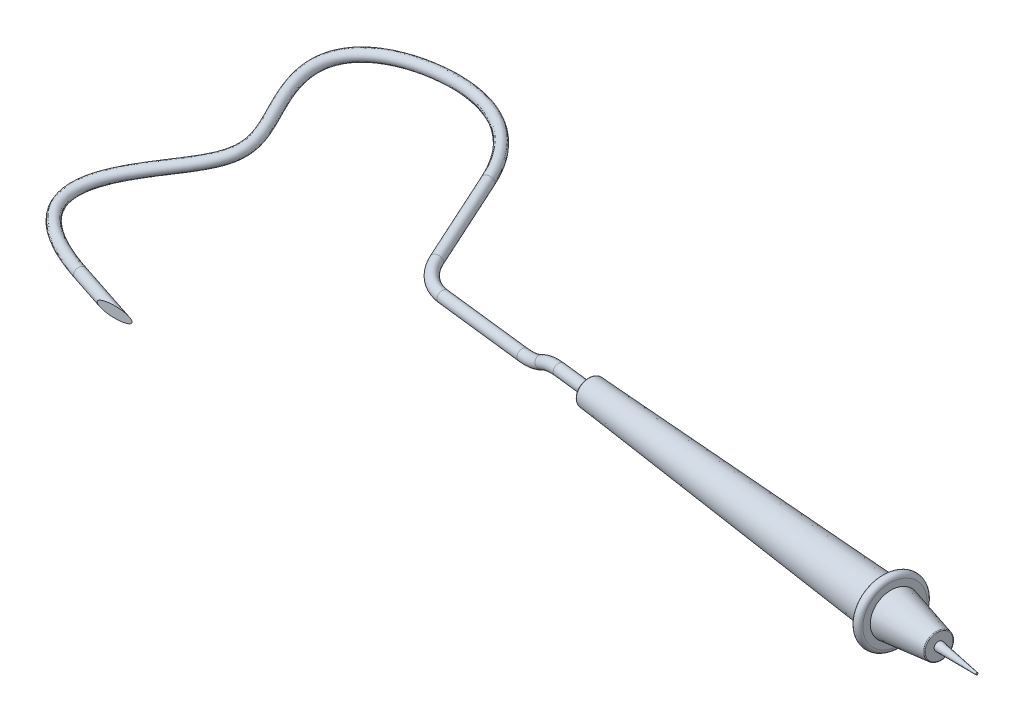
ISO-10303-21;
HEADER;
FILE_DESCRIPTION(('STEP AP214'),'2;1');
FILE_NAME('part.step','',(''),(''),'','','');
FILE_SCHEMA(('AUTOMOTIVE_DESIGN { 1 0 10303 214 1 1 1 1 }'));
ENDSEC;
DATA;
#1=APPLICATION_CONTEXT('core data for automotive mechanical design processes');
#2=APPLICATION_PROTOCOL_DEFINITION('international standard','automotive_design',2000,#1);
#3=PRODUCT_CONTEXT('',#1,'mechanical');
#4=PRODUCT('Part','Part','',(#3));
#5=PRODUCT_RELATED_PRODUCT_CATEGORY('part','',(#4));
#6=PRODUCT_DEFINITION_FORMATION('','',#4);
#7=PRODUCT_DEFINITION_CONTEXT('part definition',#1,'design');
#8=PRODUCT_DEFINITION('design','',#6,#7);
#9=PRODUCT_DEFINITION_SHAPE('','',#8);
#10=(LENGTH_UNIT() NAMED_UNIT(*) SI_UNIT(.MILLI.,.METRE.));
#11=(NAMED_UNIT(*) PLANE_ANGLE_UNIT() SI_UNIT($,.RADIAN.));
#12=(NAMED_UNIT(*) SI_UNIT($,.STERADIAN.) SOLID_ANGLE_UNIT());
#13=UNCERTAINTY_MEASURE_WITH_UNIT(LENGTH_MEASURE(1.E-05),#10,'distance_accuracy_value','');
#14=(GEOMETRIC_REPRESENTATION_CONTEXT(3) GLOBAL_UNCERTAINTY_ASSIGNED_CONTEXT((#13)) GLOBAL_UNIT_ASSIGNED_CONTEXT((#10,
#11,#12)) REPRESENTATION_CONTEXT('',''));
#15=CARTESIAN_POINT('',(0.,0.,0.));
#16=DIRECTION('',(0.,0.,1.));
#17=DIRECTION('',(1.,0.,0.));
#18=AXIS2_PLACEMENT_3D('',#15,#16,#17);
#19=CARTESIAN_POINT('',(-100.92677059176,1.28955605755528,-46.3495774754602));
#20=DIRECTION('',(-0.950247012060814,0.,-0.311497377307572));
#21=DIRECTION('',(-0.0139806644155085,0.998992289660299,0.0426491057558538));
#22=AXIS2_PLACEMENT_3D('',#19,#20,#21);
#23=CYLINDRICAL_SURFACE('',#22,1.25);
#24=CARTESIAN_POINT('',(-123.766941899785,1.28955605755528,-53.8367396232008));
#25=DIRECTION('',(-0.950247012060814,0.,-0.311497377307572));
#26=DIRECTION('',(-0.0139806644155084,0.998992289660299,0.0426491057558539));
#27=AXIS2_PLACEMENT_3D('',#24,#25,#26);
#28=CIRCLE('',#27,1.25);
#29=CARTESIAN_POINT('',(-123.749466069266,0.0408156954799094,-53.8900510053956));
#30=VERTEX_POINT('',#29);
#31=EDGE_CURVE('P0_E11',#30,#30,#28,.T.);
#32=ORIENTED_EDGE('',*,*,#31,.F.);
#33=EDGE_LOOP('',(#32));
#34=FACE_BOUND('',#33,.T.);
#35=CARTESIAN_POINT('',(-112.062668834905,1.28955605755528,-50.));
#36=DIRECTION('',(0.,0.,1.));
#37=DIRECTION('',(-1.,0.,0.));
#38=AXIS2_PLACEMENT_3D('',#35,#36,#37);
#39=ELLIPSE('',#38,4.01287487812699,1.25);
#40=CARTESIAN_POINT('',(-116.075543713031,1.28955605755528,-50.));
#41=VERTEX_POINT('',#40);
#42=EDGE_CURVE('P0_E43',#41,#41,#39,.F.);
#43=ORIENTED_EDGE('',*,*,#42,.T.);
#44=EDGE_LOOP('',(#43));
#45=FACE_BOUND('',#44,.T.);
#46=ADVANCED_FACE('P0_F40',(#34,#45),#23,.T.);
#47=CARTESIAN_POINT('',(-123.766941899785,1.28955605755528,-53.8367396232008));
#48=DIRECTION('',(0.950247012060814,0.,0.311497377307572));
#49=DIRECTION('',(-0.0139806644155084,0.998992289660299,0.0426491057558539));
#50=AXIS2_PLACEMENT_3D('',#47,#48,#49);
#51=PLANE('',#50);
#52=ORIENTED_EDGE('',*,*,#31,.T.);
#53=EDGE_LOOP('',(#52));
#54=FACE_BOUND('',#53,.T.);
#55=ADVANCED_FACE('P0_F51',(#54),#51,.F.);
#56=CARTESIAN_POINT('',(0.,0.,-50.));
#57=DIRECTION('',(0.,0.,1.));
#58=DIRECTION('',(1.,0.,0.));
#59=AXIS2_PLACEMENT_3D('',#56,#57,#58);
#60=PLANE('',#59);
#61=ORIENTED_EDGE('',*,*,#42,.F.);
#62=EDGE_LOOP('',(#61));
#63=FACE_BOUND('',#62,.T.);
#64=ADVANCED_FACE('P0_F53',(#63),#60,.T.);
#65=CLOSED_SHELL('',(#46,#55,#64));
#66=MANIFOLD_SOLID_BREP('P0_B2',#65);
#67=CARTESIAN_POINT('',(-37.564728298772,13.2649578922925,-77.7249466325446));
#68=DIRECTION('',(-0.989293869274678,-0.0311085433414069,-0.142582953913548));
#69=DIRECTION('',(-0.0552296884661834,0.984156156302759,0.168482466515979));
#70=AXIS2_PLACEMENT_3D('',#67,#68,#69);
#71=CYLINDRICAL_SURFACE('',#70,1.25);
#72=CARTESIAN_POINT('',(-29.1941082826414,13.5281737108209,-76.5185227730065));
#73=DIRECTION('',(-0.989293869274678,-0.0311085433414067,-0.142582953913548));
#74=DIRECTION('',(-0.0552296884661832,0.984156156302759,0.168482466515979));
#75=AXIS2_PLACEMENT_3D('',#72,#73,#74);
#76=CIRCLE('',#75,1.25);
#77=CARTESIAN_POINT('',(-29.1250711720587,12.2979785154425,-76.7291258561514));
#78=VERTEX_POINT('',#77);
#79=EDGE_CURVE('P1_E11',#78,#78,#76,.T.);
#80=ORIENTED_EDGE('',*,*,#79,.T.);
#81=EDGE_LOOP('',(#80));
#82=FACE_BOUND('',#81,.T.);
#83=CARTESIAN_POINT('',(-37.564728298772,13.2649578922925,-77.7249466325446));
#84=DIRECTION('',(-0.989293869274678,-0.0311085433414067,-0.142582953913548));
#85=DIRECTION('',(-0.0552296884661832,0.984156156302759,0.168482466515979));
#86=AXIS2_PLACEMENT_3D('',#83,#84,#85);
#87=CIRCLE('',#86,1.25);
#88=CARTESIAN_POINT('',(-37.4956911881893,12.0347626969141,-77.9355497156896));
#89=VERTEX_POINT('',#88);
#90=EDGE_CURVE('P1_E30',#89,#89,#87,.T.);
#91=ORIENTED_EDGE('',*,*,#90,.F.);
#92=EDGE_LOOP('',(#91));
#93=FACE_BOUND('',#92,.T.);
#94=ADVANCED_FACE('P1_F16',(#82,#93),#71,.T.);
#95=CARTESIAN_POINT('',(-37.026042810021,3.66594231229463,-79.3682486742846));
#96=DIRECTION('',(-0.135082647765971,-0.174553483329768,0.975337766996633));
#97=DIRECTION('',(-0.0552296884661834,0.984156156302759,0.168482466515979));
#98=AXIS2_PLACEMENT_3D('',#95,#96,#97);
#99=TOROIDAL_SURFACE('',#98,9.75354929044911,1.25);
#100=ORIENTED_EDGE('',*,*,#90,.T.);
#101=EDGE_LOOP('',(#100));
#102=FACE_BOUND('',#101,.T.);
#103=CARTESIAN_POINT('',(-42.5238960389427,11.6939737488602,-78.6929377177837));
#104=DIRECTION('',(-0.81487465719678,-0.540422869925287,-0.209576751382748));
#105=DIRECTION('',(-0.563677187165637,0.823088211019427,0.0692374577080555));
#106=AXIS2_PLACEMENT_3D('',#103,#104,#105);
#107=CIRCLE('',#106,1.25);
#108=CARTESIAN_POINT('',(-41.8192995549857,10.6651134850859,-78.7794845399188));
#109=VERTEX_POINT('',#108);
#110=EDGE_CURVE('P1_E81',#109,#109,#107,.T.);
#111=ORIENTED_EDGE('',*,*,#110,.F.);
#112=EDGE_LOOP('',(#111));
#113=FACE_BOUND('',#112,.T.);
#114=ADVANCED_FACE('P1_F125',(#102,#113),#99,.T.);
#115=CARTESIAN_POINT('',(-48.5174906936248,20.4458927802193,-77.9567339723218));
#116=DIRECTION('',(0.135082647765971,0.174553483329768,-0.975337766996633));
#117=DIRECTION('',(0.0552296884661834,-0.984156156302759,-0.168482466515979));
#118=AXIS2_PLACEMENT_3D('',#115,#116,#117);
#119=TOROIDAL_SURFACE('',#118,10.6330268301614,1.25);
#120=ORIENTED_EDGE('',*,*,#110,.T.);
#121=EDGE_LOOP('',(#120));
#122=FACE_BOUND('',#121,.T.);
#123=CARTESIAN_POINT('',(-47.9302319343425,9.98133396518355,-79.748212559198));
#124=DIRECTION('',(-0.989293869274678,-0.031108543341407,-0.142582953913548));
#125=DIRECTION('',(-0.0552296884661834,0.984156156302759,0.168482466515979));
#126=AXIS2_PLACEMENT_3D('',#123,#124,#125);
#127=CIRCLE('',#126,1.25);
#128=CARTESIAN_POINT('',(-47.8611948237597,8.7511387698051,-79.958815642343));
#129=VERTEX_POINT('',#128);
#130=EDGE_CURVE('P1_E153',#129,#129,#127,.T.);
#131=ORIENTED_EDGE('',*,*,#130,.F.);
#132=EDGE_LOOP('',(#131));
#133=FACE_BOUND('',#132,.T.);
#134=ADVANCED_FACE('P1_F112',(#122,#133),#119,.T.);
#135=CARTESIAN_POINT('',(-29.1941082826414,13.5281737108209,-76.5185227730065));
#136=DIRECTION('',(0.989293869274678,0.0311085433414068,0.142582953913548));
#137=DIRECTION('',(0.0552296884661832,-0.984156156302759,-0.168482466515979));
#138=AXIS2_PLACEMENT_3D('',#135,#136,#137);
#139=PLANE('',#138);
#140=ORIENTED_EDGE('',*,*,#79,.F.);
#141=EDGE_LOOP('',(#140));
#142=FACE_BOUND('',#141,.T.);
#143=ADVANCED_FACE('P1_F111',(#142),#139,.T.);
#144=CARTESIAN_POINT('',(-82.6235061058252,12.8643823183452,-107.960751642759));
#145=CARTESIAN_POINT('',(-83.9065305196409,13.3857217938381,-111.4266345033));
#146=CARTESIAN_POINT('',(-87.4736047606992,14.1111097351965,-116.833152024687));
#147=CARTESIAN_POINT('',(-94.4264787932777,14.4947694638424,-121.353421500704));
#148=CARTESIAN_POINT('',(-101.744513323956,14.4271855185951,-123.35754465081));
#149=CARTESIAN_POINT('',(-109.466253056786,14.0689839207236,-123.796421013719));
#150=CARTESIAN_POINT('',(-119.350135778554,13.3059954336876,-122.57958191239));
#151=CARTESIAN_POINT('',(-125.691421698862,12.4127177357774,-119.44039769477));
#152=CARTESIAN_POINT('',(-128.759312650844,11.5293879917575,-115.286281491645));
#153=CARTESIAN_POINT('',(-130.039110565175,10.7831941446597,-111.347067862877));
#154=CARTESIAN_POINT('',(-129.460190734525,9.94501517682309,-106.261241599214));
#155=CARTESIAN_POINT('',(-127.124230219562,9.094238663255,-100.525859544578));
#156=CARTESIAN_POINT('',(-125.312528515029,8.50741634446363,-96.5041679558861));
#157=CARTESIAN_POINT('',(-124.33519632737,7.94324603575634,-92.8883054429041));
#158=CARTESIAN_POINT('',(-124.378210910736,7.49340340720523,-90.2747414363763));
#159=CARTESIAN_POINT('',(-126.247767976614,6.82328962729056,-86.973261115542));
#160=CARTESIAN_POINT('',(-129.338907043857,6.08143354480869,-83.6531555013317));
#161=CARTESIAN_POINT('',(-133.532202523085,5.16732897887946,-79.6881896095488));
#162=CARTESIAN_POINT('',(-137.85086201998,4.13356382462671,-75.065345831023));
#163=CARTESIAN_POINT('',(-140.422098592608,3.21989429369445,-70.5711992621139));
#164=CARTESIAN_POINT('',(-141.049639801567,2.55432812490788,-66.8891417175158));
#165=CARTESIAN_POINT('',(-140.423447264118,1.90714946393672,-62.9035086954471));
#166=CARTESIAN_POINT('',(-136.656133708553,1.27495130755907,-57.9757006047941));
#167=CARTESIAN_POINT('',(-129.373251984676,1.06793858291914,-54.3791000286998));
#168=CARTESIAN_POINT('',(-124.150387238301,1.06793858291914,-52.6670097512465));
#169=CARTESIAN_POINT('',(-82.6440427602793,13.2312411455882,-107.897966192017));
#170=CARTESIAN_POINT('',(-83.9270658442534,13.7525800807181,-111.363845460207));
#171=CARTESIAN_POINT('',(-87.4941571544381,14.4779705922252,-116.77038358997));
#172=CARTESIAN_POINT('',(-94.4470405284697,14.8616308152618,-121.290659016061));
#173=CARTESIAN_POINT('',(-101.765089854883,14.7940476008404,-123.294791285281));
#174=CARTESIAN_POINT('',(-109.486839296518,14.4358455909328,-123.733668423976));
#175=CARTESIAN_POINT('',(-119.370739454654,13.6728562375333,-122.516829977719));
#176=CARTESIAN_POINT('',(-125.712042857433,12.7795753902991,-119.377633094834));
#177=CARTESIAN_POINT('',(-128.779947199942,11.896241968841,-115.223499800205));
#178=CARTESIAN_POINT('',(-130.059745756918,11.1500474285844,-111.284282333153));
#179=CARTESIAN_POINT('',(-129.480832283251,10.3118626734445,-106.198424347994));
#180=CARTESIAN_POINT('',(-127.144866187936,9.46108535899451,-100.463035785892));
#181=CARTESIAN_POINT('',(-125.333167959035,8.8742644843654,-96.4413537723163));
#182=CARTESIAN_POINT('',(-124.355836023581,8.3100948955119,-92.8254955468885));
#183=CARTESIAN_POINT('',(-124.398848485272,7.86025562314663,-90.2119504493404));
#184=CARTESIAN_POINT('',(-126.268399748869,7.19014498254184,-86.9104865641212));
#185=CARTESIAN_POINT('',(-129.359534019501,6.44829045986957,-83.5903884888608));
#186=CARTESIAN_POINT('',(-133.552831003182,5.53418517217469,-79.6254188742003));
#187=CARTESIAN_POINT('',(-137.8714925956,4.50041928011157,-75.0025714728312));
#188=CARTESIAN_POINT('',(-140.442733405394,3.58674471861284,-70.5083969078602));
#189=CARTESIAN_POINT('',(-141.070272268351,2.92117793808255,-66.82633502085));
#190=CARTESIAN_POINT('',(-140.444077085496,2.27399874865986,-62.8406980447568));
#191=CARTESIAN_POINT('',(-136.676755255651,1.64179667641408,-57.9128643679896));
#192=CARTESIAN_POINT('',(-129.393853884651,1.43478191439387,-54.3162454504921));
#193=CARTESIAN_POINT('',(-124.170991174056,1.43478191439385,-52.6041558403813));
#194=CARTESIAN_POINT('',(-83.021769974569,13.9256941808484,-107.653676626292));
#195=CARTESIAN_POINT('',(-84.2885523086728,14.440433908724,-111.075684136461));
#196=CARTESIAN_POINT('',(-87.7980679445508,15.1532528452868,-116.389914266747));
#197=CARTESIAN_POINT('',(-94.6308275871454,15.5308375883877,-120.835323639968));
#198=CARTESIAN_POINT('',(-101.85937074499,15.4644731790068,-122.817234586107));
#199=CARTESIAN_POINT('',(-109.509030206567,15.10974822612,-123.25279066666));
#200=CARTESIAN_POINT('',(-119.318624737065,14.3524277897169,-122.044708163536));
#201=CARTESIAN_POINT('',(-125.53807976208,13.4728661051508,-118.94570626708));
#202=CARTESIAN_POINT('',(-128.495380056284,12.6195288044084,-114.930532475008));
#203=CARTESIAN_POINT('',(-129.731753047819,11.9003826074839,-111.135077226412));
#204=CARTESIAN_POINT('',(-129.175788049655,11.0823222055779,-106.174294234012));
#205=CARTESIAN_POINT('',(-126.861063197854,10.2379785344395,-100.483449517271));
#206=CARTESIAN_POINT('',(-125.04160734238,9.64854590560215,-96.4439684689133));
#207=CARTESIAN_POINT('',(-124.036086474481,9.07256212448368,-92.7498595134302));
#208=CARTESIAN_POINT('',(-124.080281280875,8.59510395917265,-89.975371835007));
#209=CARTESIAN_POINT('',(-126.029505361362,7.90072556219754,-86.5582700595177));
#210=CARTESIAN_POINT('',(-129.149468184821,7.1524254945778,-83.2099718347257));
#211=CARTESIAN_POINT('',(-133.341411707777,6.23866023542713,-79.24654475429));
#212=CARTESIAN_POINT('',(-137.629350175579,5.21174594985692,-74.6536483752063));
#213=CARTESIAN_POINT('',(-140.145346643518,4.31563319709075,-70.2439480863073));
#214=CARTESIAN_POINT('',(-140.746074047777,3.67372772795067,-66.6913099738334));
#215=CARTESIAN_POINT('',(-140.14777193971,3.05479356961373,-62.8798041561067));
#216=CARTESIAN_POINT('',(-136.518531013932,2.43949157623355,-58.0959527136574));
#217=CARTESIAN_POINT('',(-129.300102598324,2.23209658835949,-54.5182474534196));
#218=CARTESIAN_POINT('',(-124.102101946806,2.23209658835948,-52.8143077938993));
#219=CARTESIAN_POINT('',(-84.1722012621356,14.067697161953,-107.206441895511));
#220=CARTESIAN_POINT('',(-85.384201855032,14.5601770762818,-110.480465395496));
#221=CARTESIAN_POINT('',(-88.699562601712,15.2305996805009,-115.483400667571));
#222=CARTESIAN_POINT('',(-95.1271797991574,15.5876936491796,-119.676308912901));
#223=CARTESIAN_POINT('',(-102.053864027796,15.5254419563338,-121.583292066346));
#224=CARTESIAN_POINT('',(-109.460395075432,15.1824437563485,-122.007648462227));
#225=CARTESIAN_POINT('',(-119.019407136229,14.4442418778545,-120.829100514432));
#226=CARTESIAN_POINT('',(-124.827922781549,13.6109457942814,-117.865641043223));
#227=CARTESIAN_POINT('',(-127.412199597295,12.858773368712,-114.319121739835));
#228=CARTESIAN_POINT('',(-128.502104013066,12.2308568619315,-111.008552836226));
#229=CARTESIAN_POINT('',(-128.02355768469,11.4806596171394,-106.469557073935));
#230=CARTESIAN_POINT('',(-125.780463662826,10.6580140125171,-100.928938280917));
#231=CARTESIAN_POINT('',(-123.934850688519,10.0597757639793,-96.8294465111379));
#232=CARTESIAN_POINT('',(-122.834251945268,9.44394565315482,-92.8714161337913));
#233=CARTESIAN_POINT('',(-122.882429438474,8.87333997404876,-89.5541316974332));
#234=CARTESIAN_POINT('',(-125.100367754924,8.09711658141089,-85.7470353179699));
#235=CARTESIAN_POINT('',(-128.317554594741,7.32708018061644,-82.3036393995974));
#236=CARTESIAN_POINT('',(-132.504936747324,6.41446001982057,-78.3454059309887));
#237=CARTESIAN_POINT('',(-136.689254316078,5.41065370544145,-73.8535224494864));
#238=CARTESIAN_POINT('',(-139.018927524055,4.573762769989,-69.7286763741293));
#239=CARTESIAN_POINT('',(-139.529216712677,4.01166306640034,-66.6125611979682));
#240=CARTESIAN_POINT('',(-139.024988664157,3.48799531562319,-63.3883728889212));
#241=CARTESIAN_POINT('',(-135.861460600602,2.9296859457502,-59.0900961135305));
#242=CARTESIAN_POINT('',(-128.860444551578,2.72100345617419,-55.5761394128372));
#243=CARTESIAN_POINT('',(-123.746306215353,2.72100345617418,-53.8996903856864));
#244=CARTESIAN_POINT('',(-85.0371584393105,13.1971765017082,-107.017190147199));
#245=CARTESIAN_POINT('',(-86.2052236312799,13.6718038649646,-110.172529270328));
#246=CARTESIAN_POINT('',(-89.3655492815078,14.3083364158414,-114.926681119537));
#247=CARTESIAN_POINT('',(-95.4688364554395,14.6490275203271,-118.917457792131));
#248=CARTESIAN_POINT('',(-102.154116703448,14.590093920072,-120.764689058021));
#249=CARTESIAN_POINT('',(-109.366143197454,14.2564789628481,-121.180095859302));
#250=CARTESIAN_POINT('',(-118.724918907611,13.5335688676309,-120.025232936244));
#251=CARTESIAN_POINT('',(-124.204713386141,12.7372450494808,-117.169982439959));
#252=CARTESIAN_POINT('',(-126.490521718637,12.0660165729388,-113.998440816507));
#253=CARTESIAN_POINT('',(-127.46308795748,11.5111764161273,-111.076268344279));
#254=CARTESIAN_POINT('',(-127.046771545773,10.8151743210453,-106.874241943334));
#255=CARTESIAN_POINT('',(-124.86089797626,10.0098893757446,-101.453789170703));
#256=CARTESIAN_POINT('',(-122.994434860002,9.40464060683169,-97.3065120509287));
#257=CARTESIAN_POINT('',(-121.817662662293,8.75690598458767,-93.1371477690947));
#258=CARTESIAN_POINT('',(-121.868965182364,8.11177027148821,-89.3855356603259));
#259=CARTESIAN_POINT('',(-124.302030457546,7.27006624964169,-85.2664675337145));
#260=CARTESIAN_POINT('',(-127.596968754839,6.48266217522677,-81.7471093244003));
#261=CARTESIAN_POINT('',(-131.780742977785,5.57093703745495,-77.7929212475965));
#262=CARTESIAN_POINT('',(-135.882099414228,4.5856230361722,-73.3818616438976));
#263=CARTESIAN_POINT('',(-138.062612809698,3.79602694057307,-69.4843831909329));
#264=CARTESIAN_POINT('',(-138.500365123477,3.29785268429437,-66.7178974731525));
#265=CARTESIAN_POINT('',(-138.07143165205,2.85050084232951,-63.9641751369551));
#266=CARTESIAN_POINT('',(-135.280799015218,2.33773489905273,-60.0541686858591));
#267=CARTESIAN_POINT('',(-128.453372830675,2.12795731511228,-56.5907191414987));
#268=CARTESIAN_POINT('',(-123.406492751743,2.12795731511226,-54.9363178245571));
#269=CARTESIAN_POINT('',(-84.9720951238983,11.9749509576749,-107.225123385331));
#270=CARTESIAN_POINT('',(-86.1401564298431,12.4495767418981,-110.380452010993));
#271=CARTESIAN_POINT('',(-89.2995154719867,13.0859488376806,-115.133349733665));
#272=CARTESIAN_POINT('',(-95.4019350622346,13.4265951033053,-119.123580089367));
#273=CARTESIAN_POINT('',(-102.086226138731,13.3676341930847,-120.970327572541));
#274=CARTESIAN_POINT('',(-109.297552513169,13.0340505441467,-121.385687750908));
#275=CARTESIAN_POINT('',(-118.655281628217,12.3112000047304,-120.23082963005));
#276=CARTESIAN_POINT('',(-124.13384583887,11.5150663600816,-117.376286703596));
#277=CARTESIAN_POINT('',(-126.418645851798,10.8441133498592,-114.206023626827));
#278=CARTESIAN_POINT('',(-127.39101805596,10.2894068614672,-111.284568345685));
#279=CARTESIAN_POINT('',(-126.97451126871,9.59373480078631,-107.084407367369));
#280=CARTESIAN_POINT('',(-124.788962948931,8.78850946902067,-101.664409434168));
#281=CARTESIAN_POINT('',(-122.922318164649,8.1831875520557,-97.5166454828799));
#282=CARTESIAN_POINT('',(-121.74542722813,7.53537630195322,-93.34679467157));
#283=CARTESIAN_POINT('',(-121.796827069537,6.88998825752452,-89.5937405231099));
#284=CARTESIAN_POINT('',(-124.230450563191,6.04805419504339,-85.4735116485672));
#285=CARTESIAN_POINT('',(-127.525708819158,5.26055726552562,-81.9537159296131));
#286=CARTESIAN_POINT('',(-131.709412064655,4.34886499756722,-77.9996965882715));
#287=CARTESIAN_POINT('',(-135.810559451231,3.36360944801641,-73.5889098905536));
#288=CARTESIAN_POINT('',(-137.990676426404,2.57430049532103,-69.6929787753764));
#289=CARTESIAN_POINT('',(-138.428428912138,2.07624340478097,-66.9271775138626));
#290=CARTESIAN_POINT('',(-137.999717729614,1.62902259924046,-64.1742934681621));
#291=CARTESIAN_POINT('',(-135.209974610092,1.11649251268096,-60.2659563160149));
#292=CARTESIAN_POINT('',(-128.383654151095,0.906802592547032,-56.8033813062892));
#293=CARTESIAN_POINT('',(-123.336780021062,0.90680259254702,-55.1489819394367));
#294=CARTESIAN_POINT('',(-84.0164562571135,11.3195315600194,-107.677476815889));
#295=CARTESIAN_POINT('',(-85.2284396409019,11.8120044816618,-110.951453828252));
#296=CARTESIAN_POINT('',(-88.5442593185891,12.4824996801625,-115.954963585777));
#297=CARTESIAN_POINT('',(-94.9722069672985,12.839610885446,-120.148080839391));
#298=CARTESIAN_POINT('',(-101.899324435867,12.7773755456725,-122.055301534961));
#299=CARTESIAN_POINT('',(-109.306151722651,12.4343643998003,-122.479679419259));
#300=CARTESIAN_POINT('',(-118.865646449774,11.6961367700965,-121.301139272271));
#301=CARTESIAN_POINT('',(-124.674688402635,10.8627532413993,-118.337341535265));
#302=CARTESIAN_POINT('',(-127.259383796441,10.1104662009778,-114.790289945176));
#303=CARTESIAN_POINT('',(-128.349342407943,9.48250894697573,-111.479500790662));
#304=CARTESIAN_POINT('',(-127.870927276511,8.73215556139763,-106.939635970881));
#305=CARTESIAN_POINT('',(-125.627681054065,7.90948508423321,-101.398821997577));
#306=CARTESIAN_POINT('',(-123.782157979006,7.31128364251734,-97.2995746969625));
#307=CARTESIAN_POINT('',(-122.681590478689,6.69548128469213,-93.3417166747766));
#308=CARTESIAN_POINT('',(-122.729716272961,6.12498042553303,-90.0250275756195));
#309=CARTESIAN_POINT('',(-124.947444807669,5.34885367779057,-86.2184269598418));
#310=CARTESIAN_POINT('',(-128.164491364486,4.57886027457934,-82.7752362174175));
#311=CARTESIAN_POINT('',(-132.351910637051,3.66622258213511,-78.8169125094212));
#312=CARTESIAN_POINT('',(-136.536305713358,2.6623925266416,-74.3249157565125));
#313=CARTESIAN_POINT('',(-138.866129487904,1.82536580544509,-70.1993258730086));
#314=CARTESIAN_POINT('',(-139.376386671882,1.26323032856978,-67.0829912431107));
#315=CARTESIAN_POINT('',(-138.872070523248,0.739524691083475,-63.8585527467253));
#316=CARTESIAN_POINT('',(-135.708221412225,0.181106733645528,-59.559536437573));
#317=CARTESIAN_POINT('',(-128.706678727892,-0.0276240447204187,-56.0451250331025));
#318=CARTESIAN_POINT('',(-123.592566736132,-0.0276240447204274,-54.3686846418449));
#319=CARTESIAN_POINT('',(-82.8985500478448,11.7245412173904,-108.030389330743));
#320=CARTESIAN_POINT('',(-84.1653403609979,12.2392841874439,-111.452418395022));
#321=CARTESIAN_POINT('',(-87.6747535821177,12.9520877031149,-116.766524875049));
#322=CARTESIAN_POINT('',(-94.5074571759935,13.3296694798715,-121.211898547823));
#323=CARTESIAN_POINT('',(-101.735911559426,13.2633006855347,-123.193754779281));
#324=CARTESIAN_POINT('',(-109.38551276818,12.908578204865,-123.62930620512));
#325=CARTESIAN_POINT('',(-119.195002680462,12.1512629666424,-122.421219771558));
#326=CARTESIAN_POINT('',(-125.414352810655,11.2717201780204,-119.322293866695));
#327=CARTESIAN_POINT('',(-128.371572761696,10.4184049419074,-115.307222623651));
#328=CARTESIAN_POINT('',(-129.607941897363,9.69926290393553,-111.511790404754));
#329=CARTESIAN_POINT('',(-129.051938757297,8.88123722584921,-106.551197741331));
#330=CARTESIAN_POINT('',(-126.73724738761,8.03689836000248,-100.860392069389));
#331=CARTESIAN_POINT('',(-124.917770678343,7.44745706619149,-96.8208535703318));
#332=CARTESIAN_POINT('',(-123.912248297218,6.87146896595034,-93.1267188895239));
#333=CARTESIAN_POINT('',(-123.956455833659,6.39399066352426,-90.3521177572226));
#334=CARTESIAN_POINT('',(-125.905714727832,5.69959343068988,-86.9349173680426));
#335=CARTESIAN_POINT('',(-129.02570633096,4.95128400421242,-83.586573909551));
#336=CARTESIAN_POINT('',(-133.217640827191,4.03752307565579,-79.6231691663808));
#337=CARTESIAN_POINT('',(-137.505566721862,3.01061321694775,-75.0302945243574));
#338=CARTESIAN_POINT('',(-140.021537766801,2.11453064758045,-70.6207622118303));
#339=CARTESIAN_POINT('',(-140.62227924707,1.47262884890262,-67.068150153828));
#340=CARTESIAN_POINT('',(-140.023993011441,0.853697861274868,-63.2566680602484));
#341=CARTESIAN_POINT('',(-136.394801731343,0.238419363103501,-58.4729701344844));
#342=CARTESIAN_POINT('',(-129.176491198476,0.0310365995111351,-54.8953749226659));
#343=CARTESIAN_POINT('',(-123.978478332275,0.0310365995111334,-53.1914312590905));
#344=CARTESIAN_POINT('',(-82.6029694513711,12.4975234911022,-108.0235370935));
#345=CARTESIAN_POINT('',(-83.8859951950284,13.0188635069581,-111.489423546394));
#346=CARTESIAN_POINT('',(-87.4530523669604,13.7442488781679,-116.895920459404));
#347=CARTESIAN_POINT('',(-94.4059170580857,14.1279081124231,-121.416183985346));
#348=CARTESIAN_POINT('',(-101.723936793029,14.0603234363498,-123.420298016339));
#349=CARTESIAN_POINT('',(-109.445666817055,13.7021222505145,-123.859173603463));
#350=CARTESIAN_POINT('',(-119.329532102454,12.9391346298418,-122.64233384706));
#351=CARTESIAN_POINT('',(-125.670800540291,12.0458600812557,-119.503162294706));
#352=CARTESIAN_POINT('',(-128.738678101746,11.162534014674,-115.349063183086));
#353=CARTESIAN_POINT('',(-130.018475373433,10.4163408607349,-111.4098533926));
#354=CARTESIAN_POINT('',(-129.439549185799,9.57816768020163,-106.324058850434));
#355=CARTESIAN_POINT('',(-127.103594251188,8.72739196751549,-100.588683303265));
#356=CARTESIAN_POINT('',(-125.291889071023,8.14056820456184,-96.5669821394558));
#357=CARTESIAN_POINT('',(-124.31455663116,7.57639717600079,-92.9511153389197));
#358=CARTESIAN_POINT('',(-124.3575733362,7.12655119126383,-90.3375324234123));
#359=CARTESIAN_POINT('',(-126.227136204359,6.45643427203929,-87.0360356669629));
#360=CARTESIAN_POINT('',(-129.318280068214,5.71457662974778,-83.7159225138026));
#361=CARTESIAN_POINT('',(-133.511574042987,4.80047278558424,-79.7509603448972));
#362=CARTESIAN_POINT('',(-137.83023144436,3.76670836914185,-75.1281201892149));
#363=CARTESIAN_POINT('',(-140.401463779822,2.85304386877607,-70.6340016163678));
#364=CARTESIAN_POINT('',(-141.029007334782,2.1874783117332,-66.9519484141815));
#365=CARTESIAN_POINT('',(-140.40281744274,1.54030017921357,-62.9663193461374));
#366=CARTESIAN_POINT('',(-136.635512161455,0.908105938704048,-58.0385368415985));
#367=CARTESIAN_POINT('',(-129.352650084702,0.701095251444411,-54.4419546069074));
#368=CARTESIAN_POINT('',(-124.129783302545,0.701095251444418,-52.7298636621118));
#369=CARTESIAN_POINT('',(-82.6235061058252,12.8643823183452,-107.960751642759));
#370=CARTESIAN_POINT('',(-83.9065305196409,13.3857217938381,-111.4266345033));
#371=CARTESIAN_POINT('',(-87.4736047606992,14.1111097351965,-116.833152024687));
#372=CARTESIAN_POINT('',(-94.4264787932777,14.4947694638424,-121.353421500704));
#373=CARTESIAN_POINT('',(-101.744513323956,14.4271855185951,-123.35754465081));
#374=CARTESIAN_POINT('',(-109.466253056786,14.0689839207236,-123.796421013719));
#375=CARTESIAN_POINT('',(-119.350135778554,13.3059954336876,-122.57958191239));
#376=CARTESIAN_POINT('',(-125.691421698862,12.4127177357774,-119.44039769477));
#377=CARTESIAN_POINT('',(-128.759312650844,11.5293879917575,-115.286281491645));
#378=CARTESIAN_POINT('',(-130.039110565175,10.7831941446597,-111.347067862877));
#379=CARTESIAN_POINT('',(-129.460190734525,9.94501517682309,-106.261241599214));
#380=CARTESIAN_POINT('',(-127.124230219562,9.094238663255,-100.525859544578));
#381=CARTESIAN_POINT('',(-125.312528515029,8.50741634446363,-96.5041679558861));
#382=CARTESIAN_POINT('',(-124.33519632737,7.94324603575634,-92.8883054429041));
#383=CARTESIAN_POINT('',(-124.378210910736,7.49340340720523,-90.2747414363763));
#384=CARTESIAN_POINT('',(-126.247767976614,6.82328962729056,-86.973261115542));
#385=CARTESIAN_POINT('',(-129.338907043857,6.08143354480869,-83.6531555013317));
#386=CARTESIAN_POINT('',(-133.532202523085,5.16732897887946,-79.6881896095488));
#387=CARTESIAN_POINT('',(-137.85086201998,4.13356382462671,-75.065345831023));
#388=CARTESIAN_POINT('',(-140.422098592608,3.21989429369445,-70.5711992621139));
#389=CARTESIAN_POINT('',(-141.049639801567,2.55432812490788,-66.8891417175158));
#390=CARTESIAN_POINT('',(-140.423447264118,1.90714946393672,-62.9035086954471));
#391=CARTESIAN_POINT('',(-136.656133708553,1.27495130755907,-57.9757006047941));
#392=CARTESIAN_POINT('',(-129.373251984676,1.06793858291914,-54.3791000286998));
#393=CARTESIAN_POINT('',(-124.150387238301,1.06793858291914,-52.6670097512465));
#394=(BOUNDED_SURFACE() B_SPLINE_SURFACE(3,3,((#144,#145,#146,#147,#148,#149,#150,#151,#152,
#153,#154,#155,#156,#157,#158,#159,#160,#161,#162,#163,#164,#165,#166,#167,#168),(#169,#170,
#171,#172,#173,#174,#175,#176,#177,#178,#179,#180,#181,#182,#183,#184,#185,#186,#187,#188,#189,
#190,#191,#192,#193),(#194,#195,#196,#197,#198,#199,#200,#201,#202,#203,#204,#205,#206,#207,
#208,#209,#210,#211,#212,#213,#214,#215,#216,#217,#218),(#219,#220,#221,#222,#223,#224,#225,
#226,#227,#228,#229,#230,#231,#232,#233,#234,#235,#236,#237,#238,#239,#240,#241,#242,#243),
(#244,#245,#246,#247,#248,#249,#250,#251,#252,#253,#254,#255,#256,#257,#258,#259,#260,#261,#262,
#263,#264,#265,#266,#267,#268),(#269,#270,#271,#272,#273,#274,#275,#276,#277,#278,#279,#280,
#281,#282,#283,#284,#285,#286,#287,#288,#289,#290,#291,#292,#293),(#294,#295,#296,#297,#298,
#299,#300,#301,#302,#303,#304,#305,#306,#307,#308,#309,#310,#311,#312,#313,#314,#315,#316,#317,
#318),(#319,#320,#321,#322,#323,#324,#325,#326,#327,#328,#329,#330,#331,#332,#333,#334,#335,
#336,#337,#338,#339,#340,#341,#342,#343),(#344,#345,#346,#347,#348,#349,#350,#351,#352,#353,
#354,#355,#356,#357,#358,#359,#360,#361,#362,#363,#364,#365,#366,#367,#368),(#369,#370,#371,
#372,#373,#374,#375,#376,#377,#378,#379,#380,#381,#382,#383,#384,#385,#386,#387,#388,#389,#390,
#391,#392,#393)),.UNSPECIFIED.,.T.,.F.,.F.) B_SPLINE_SURFACE_WITH_KNOTS((4,1,1,1,1,1,1,4),(4,1,
1,1,1,1,1,1,1,1,1,1,1,1,1,1,1,1,1,1,1,1,4),(-3.14159265358979,-2.24399475256414,
-1.34639685153848,-0.448798950512828,0.448798950512827,1.34639685153848,2.24399475256414,
3.14159265358979),(1.,1.17857142857143,1.35714285714286,1.53571428571429,1.71428571428571,
1.95238095238095,2.42857142857143,2.60714285714286,2.78571428571429,3.14285714285714,3.5,
3.85714285714286,3.97619047619048,4.33333333333333,4.57142857142857,4.80952380952381,
5.04761904761905,5.28571428571429,5.46428571428571,5.55357142857143,5.64285714285714,
5.82142857142857,6.),
.UNSPECIFIED.) GEOMETRIC_REPRESENTATION_ITEM() RATIONAL_B_SPLINE_SURFACE(((1.,1.,1.,1.,1.,1.,1.,
1.,1.,1.,1.,1.,1.,1.,1.,1.,1.,1.,1.,1.,1.,1.,1.,1.,1.),(1.,1.,1.,1.,1.,1.,1.,1.,1.,1.,1.,1.,1.,
1.,1.,1.,1.,1.,1.,1.,1.,1.,1.,1.,1.),(1.,1.,1.,1.,1.,1.,1.,1.,1.,1.,1.,1.,1.,1.,1.,1.,1.,1.,1.,
1.,1.,1.,1.,1.,1.),(1.,1.,1.,1.,1.,1.,1.,1.,1.,1.,1.,1.,1.,1.,1.,1.,1.,1.,1.,1.,1.,1.,1.,1.,1.),
(1.,1.,1.,1.,1.,1.,1.,1.,1.,1.,1.,1.,1.,1.,1.,1.,1.,1.,1.,1.,1.,1.,1.,1.,1.),(1.,1.,1.,1.,1.,1.,
1.,1.,1.,1.,1.,1.,1.,1.,1.,1.,1.,1.,1.,1.,1.,1.,1.,1.,1.),(1.,1.,1.,1.,1.,1.,1.,1.,1.,1.,1.,1.,
1.,1.,1.,1.,1.,1.,1.,1.,1.,1.,1.,1.,1.),(1.,1.,1.,1.,1.,1.,1.,1.,1.,1.,1.,1.,1.,1.,1.,1.,1.,1.,
1.,1.,1.,1.,1.,1.,1.),(1.,1.,1.,1.,1.,1.,1.,1.,1.,1.,1.,1.,1.,1.,1.,1.,1.,1.,1.,1.,1.,1.,1.,1.,
1.),(1.,1.,1.,1.,1.,1.,1.,1.,1.,1.,1.,1.,1.,1.,1.,1.,1.,1.,1.,1.,1.,1.,1.,1.,1.))) REPRESENTATION_ITEM('') SURFACE());
#395=CARTESIAN_POINT('',(-82.6235061058252,12.8643823183452,-107.960751642759));
#396=CARTESIAN_POINT('',(-82.6029694513711,12.4975234911022,-108.0235370935));
#397=CARTESIAN_POINT('',(-82.8985500478448,11.7245412173904,-108.030389330743));
#398=CARTESIAN_POINT('',(-84.0164562571135,11.3195315600194,-107.677476815889));
#399=CARTESIAN_POINT('',(-84.9720951238983,11.9749509576749,-107.225123385331));
#400=CARTESIAN_POINT('',(-85.0371584393105,13.1971765017082,-107.017190147199));
#401=CARTESIAN_POINT('',(-84.1722012621356,14.067697161953,-107.206441895511));
#402=CARTESIAN_POINT('',(-83.021769974569,13.9256941808484,-107.653676626292));
#403=CARTESIAN_POINT('',(-82.6440427602793,13.2312411455882,-107.897966192017));
#404=CARTESIAN_POINT('',(-82.6235061058252,12.8643823183452,-107.960751642759));
#405=(BOUNDED_CURVE() B_SPLINE_CURVE(3,(#395,#396,#397,#398,#399,#400,#401,#402,#403,#404),
.UNSPECIFIED.,.T.,.F.) B_SPLINE_CURVE_WITH_KNOTS((4,1,1,1,1,1,1,4),(-3.14159265358979,
-2.24399475256414,-1.34639685153848,-0.448798950512827,0.448798950512828,1.34639685153848,
2.24399475256414,3.14159265358979),
.UNSPECIFIED.) CURVE() GEOMETRIC_REPRESENTATION_ITEM() RATIONAL_B_SPLINE_CURVE((1.,1.,1.,1.,1.,
1.,1.,1.,1.,1.)) REPRESENTATION_ITEM(''));
#406=CARTESIAN_POINT('',(-82.624214750196,12.8641508422811,-107.960524130556));
#407=VERTEX_POINT('',#406);
#408=EDGE_CURVE('P1_E75',#407,#407,#405,.F.);
#409=CARTESIAN_POINT('',(-82.6235061058252,12.8643823183452,-107.960751642759));
#410=CARTESIAN_POINT('',(-83.9065305196409,13.3857217938381,-111.4266345033));
#411=CARTESIAN_POINT('',(-87.4736047606992,14.1111097351965,-116.833152024687));
#412=CARTESIAN_POINT('',(-94.4264787932777,14.4947694638424,-121.353421500704));
#413=CARTESIAN_POINT('',(-101.744513323956,14.4271855185951,-123.35754465081));
#414=CARTESIAN_POINT('',(-109.466253056786,14.0689839207236,-123.796421013719));
#415=CARTESIAN_POINT('',(-119.350135778554,13.3059954336876,-122.57958191239));
#416=CARTESIAN_POINT('',(-125.691421698862,12.4127177357774,-119.44039769477));
#417=CARTESIAN_POINT('',(-128.759312650844,11.5293879917575,-115.286281491645));
#418=CARTESIAN_POINT('',(-130.039110565175,10.7831941446597,-111.347067862877));
#419=CARTESIAN_POINT('',(-129.460190734525,9.94501517682309,-106.261241599214));
#420=CARTESIAN_POINT('',(-127.124230219562,9.094238663255,-100.525859544578));
#421=CARTESIAN_POINT('',(-125.312528515029,8.50741634446363,-96.5041679558861));
#422=CARTESIAN_POINT('',(-124.33519632737,7.94324603575634,-92.8883054429041));
#423=CARTESIAN_POINT('',(-124.378210910736,7.49340340720523,-90.2747414363763));
#424=CARTESIAN_POINT('',(-126.247767976614,6.82328962729056,-86.973261115542));
#425=CARTESIAN_POINT('',(-129.338907043857,6.08143354480869,-83.6531555013317));
#426=CARTESIAN_POINT('',(-133.532202523085,5.16732897887946,-79.6881896095488));
#427=CARTESIAN_POINT('',(-137.85086201998,4.13356382462671,-75.065345831023));
#428=CARTESIAN_POINT('',(-140.422098592608,3.21989429369445,-70.5711992621139));
#429=CARTESIAN_POINT('',(-141.049639801567,2.55432812490788,-66.8891417175158));
#430=CARTESIAN_POINT('',(-140.423447264118,1.90714946393672,-62.9035086954471));
#431=CARTESIAN_POINT('',(-136.656133708553,1.27495130755907,-57.9757006047941));
#432=CARTESIAN_POINT('',(-129.373251984676,1.06793858291914,-54.3791000286998));
#433=CARTESIAN_POINT('',(-124.150387238301,1.06793858291914,-52.6670097512465));
#434=(BOUNDED_CURVE() B_SPLINE_CURVE(3,(#409,#410,#411,#412,#413,#414,#415,#416,#417,#418,#419,
#420,#421,#422,#423,#424,#425,#426,#427,#428,#429,#430,#431,#432,#433),.UNSPECIFIED.,.F.,
.F.) B_SPLINE_CURVE_WITH_KNOTS((4,1,1,1,1,1,1,1,1,1,1,1,1,1,1,1,1,1,1,1,1,1,4),(1.,
1.17857142857143,1.35714285714286,1.53571428571429,1.71428571428571,1.95238095238095,
2.42857142857143,2.60714285714286,2.78571428571429,3.14285714285714,3.5,3.85714285714286,
3.97619047619048,4.33333333333333,4.57142857142857,4.80952380952381,5.04761904761905,
5.28571428571429,5.46428571428571,5.55357142857143,5.64285714285714,5.82142857142857,6.),
.UNSPECIFIED.) CURVE() GEOMETRIC_REPRESENTATION_ITEM() RATIONAL_B_SPLINE_CURVE((1.,1.,1.,1.,1.,
1.,1.,1.,1.,1.,1.,1.,1.,1.,1.,1.,1.,1.,1.,1.,1.,1.,1.,1.,1.)) REPRESENTATION_ITEM(''));
#435=CARTESIAN_POINT('',(-124.150144476722,1.06792622818047,-52.66775031454));
#436=VERTEX_POINT('',#435);
#437=EDGE_CURVE('P1_E74',#407,#436,#434,.T.);
#438=CARTESIAN_POINT('',(-124.150387238526,1.06793858291914,-52.6670097513205));
#439=CARTESIAN_POINT('',(-124.170991174281,1.43478191439385,-52.6041558404552));
#440=CARTESIAN_POINT('',(-124.10210194703,2.23209658835948,-52.8143077939728));
#441=CARTESIAN_POINT('',(-123.746306215574,2.72100345617418,-53.8996903857587));
#442=CARTESIAN_POINT('',(-123.406492751961,2.12795731511226,-54.9363178246285));
#443=CARTESIAN_POINT('',(-123.33678002128,0.90680259254702,-55.1489819395081));
#444=CARTESIAN_POINT('',(-123.592566736353,-0.0276240447204274,-54.3686846419173));
#445=CARTESIAN_POINT('',(-123.978478332499,0.0310365995111334,-53.191431259164));
#446=CARTESIAN_POINT('',(-124.129783302771,0.701095251444418,-52.7298636621857));
#447=CARTESIAN_POINT('',(-124.150387238526,1.06793858291914,-52.6670097513205));
#448=(BOUNDED_CURVE() B_SPLINE_CURVE(3,(#438,#439,#440,#441,#442,#443,#444,#445,#446,#447),
.UNSPECIFIED.,.T.,.F.) B_SPLINE_CURVE_WITH_KNOTS((4,1,1,1,1,1,1,4),(-3.14159265358979,
-2.24399475256414,-1.34639685153848,-0.448798950512828,0.448798950512827,1.34639685153848,
2.24399475256414,3.14159265358979),
.UNSPECIFIED.) CURVE() GEOMETRIC_REPRESENTATION_ITEM() RATIONAL_B_SPLINE_CURVE((1.,1.,1.,1.,1.,
1.,1.,1.,1.,1.)) REPRESENTATION_ITEM(''));
#449=EDGE_CURVE('P1_E67',#436,#436,#448,.T.);
#450=ORIENTED_EDGE('',*,*,#408,.F.);
#451=ORIENTED_EDGE('',*,*,#437,.T.);
#452=ORIENTED_EDGE('',*,*,#449,.T.);
#453=ORIENTED_EDGE('',*,*,#437,.F.);
#454=EDGE_LOOP('',(#450,#451,#452,#453));
#455=FACE_BOUND('',#454,.T.);
#456=ADVANCED_FACE('P1_F78',(#455),#394,.F.);
#457=CARTESIAN_POINT('',(2888.05530741726,358.927759123091,-1155.61212651842));
#458=DIRECTION('',(-0.0552296884661834,0.984156156302759,0.168482466515979));
#459=DIRECTION('',(0.989293869274678,0.031108543341407,0.142582953913548));
#460=AXIS2_PLACEMENT_3D('',#457,#458,#459);
#461=TOROIDAL_SURFACE('',#460,3170.20420042437,1.25);
#462=ORIENTED_EDGE('',*,*,#408,.T.);
#463=EDGE_LOOP('',(#462));
#464=FACE_BOUND('',#463,.T.);
#465=CARTESIAN_POINT('',(-76.7628718267572,9.90162792875247,-88.7341596655931));
#466=DIRECTION('',(0.349750120959316,-0.138980492742628,0.926476807872685));
#467=DIRECTION('',(-0.935213630354516,-0.11009578851344,0.336532885392693));
#468=AXIS2_PLACEMENT_3D('',#465,#466,#467);
#469=CIRCLE('',#468,1.25);
#470=CARTESIAN_POINT('',(-75.593854788814,10.0392476643943,-89.154825772334));
#471=VERTEX_POINT('',#470);
#472=EDGE_CURVE('P1_E89',#471,#471,#469,.T.);
#473=ORIENTED_EDGE('',*,*,#472,.F.);
#474=EDGE_LOOP('',(#473));
#475=FACE_BOUND('',#474,.T.);
#476=ADVANCED_FACE('P1_F110',(#464,#475),#461,.T.);
#477=CARTESIAN_POINT('',(-68.1332690839428,10.9175272780463,-91.8394877067714));
#478=DIRECTION('',(-0.0552296884661834,0.984156156302759,0.168482466515979));
#479=DIRECTION('',(0.989293869274678,0.031108543341407,0.142582953913548));
#480=AXIS2_PLACEMENT_3D('',#477,#478,#479);
#481=TOROIDAL_SURFACE('',#480,9.22741335532405,1.25);
#482=ORIENTED_EDGE('',*,*,#472,.T.);
#483=EDGE_LOOP('',(#482));
#484=FACE_BOUND('',#483,.T.);
#485=CARTESIAN_POINT('',(-69.3797325120111,9.30685013475088,-82.8396429696347));
#486=DIRECTION('',(0.989293869274678,0.031108543341407,0.142582953913548));
#487=DIRECTION('',(-0.135082647765971,-0.174553483329768,0.975337766996633));
#488=AXIS2_PLACEMENT_3D('',#485,#486,#487);
#489=CIRCLE('',#488,1.25);
#490=CARTESIAN_POINT('',(-69.2108792023036,9.52504198891309,-84.0588151783805));
#491=VERTEX_POINT('',#490);
#492=EDGE_CURVE('P1_E157',#491,#491,#489,.T.);
#493=ORIENTED_EDGE('',*,*,#492,.F.);
#494=EDGE_LOOP('',(#493));
#495=FACE_BOUND('',#494,.T.);
#496=ADVANCED_FACE('P1_F114',(#484,#495),#481,.T.);
#497=CARTESIAN_POINT('',(-58.8613391130598,9.63760311634284,-81.323669154547));
#498=DIRECTION('',(0.989293869274678,0.031108543341407,0.142582953913548));
#499=DIRECTION('',(-0.135082647765971,-0.174553483329768,0.975337766996633));
#500=AXIS2_PLACEMENT_3D('',#497,#498,#499);
#501=CYLINDRICAL_SURFACE('',#500,1.25);
#502=ORIENTED_EDGE('',*,*,#130,.T.);
#503=EDGE_LOOP('',(#502));
#504=FACE_BOUND('',#503,.T.);
#505=ORIENTED_EDGE('',*,*,#492,.T.);
#506=EDGE_LOOP('',(#505));
#507=FACE_BOUND('',#506,.T.);
#508=ADVANCED_FACE('P1_F123',(#504,#507),#501,.T.);
#509=CARTESIAN_POINT('',(-123.766941899786,1.2895560575532,-53.8367396232));
#510=DIRECTION('',(-0.950247012060814,0.,-0.311497377307571));
#511=DIRECTION('',(-0.306562061549409,-0.177303863498176,0.935191446927952));
#512=AXIS2_PLACEMENT_3D('',#509,#510,#511);
#513=PLANE('',#512);
#514=ORIENTED_EDGE('',*,*,#449,.F.);
#515=EDGE_LOOP('',(#514));
#516=FACE_BOUND('',#515,.T.);
#517=ADVANCED_FACE('P1_F18',(#516),#513,.F.);
#518=CLOSED_SHELL('',(#94,#114,#134,#143,#456,#476,#496,#508,#517));
#519=MANIFOLD_SOLID_BREP('P1_B1',#518);
#520=CARTESIAN_POINT('',(-28.9962495087861,13.5343954194893,-76.4900061822243));
#521=DIRECTION('',(-0.989293869274677,-0.0311085433414067,-0.14258295391355));
#522=DIRECTION('',(-0.145556616440524,0.139826282394956,0.979419155500847));
#523=AXIS2_PLACEMENT_3D('',#520,#521,#522);
#524=TOROIDAL_SURFACE('',#523,2.8049002995662,0.2);
#525=CARTESIAN_POINT('',(-29.0011567164614,13.5342411113637,-76.4907134383668));
#526=DIRECTION('',(-0.989293869274677,-0.0311085433414067,-0.14258295391355));
#527=DIRECTION('',(0.145556616440524,-0.139826282394956,-0.979419155500847));
#528=AXIS2_PLACEMENT_3D('',#525,#526,#527);
#529=CIRCLE('',#528,3.0048387783305);
#530=CARTESIAN_POINT('',(-29.4385308819845,13.9543965469338,-73.5477167796782));
#531=VERTEX_POINT('',#530);
#532=EDGE_CURVE('P2_E11',#531,#531,#529,.T.);
#533=ORIENTED_EDGE('',*,*,#532,.T.);
#534=EDGE_LOOP('',(#533));
#535=FACE_BOUND('',#534,.T.);
#536=CARTESIAN_POINT('',(-29.194108282641,13.528173710821,-76.518522773007));
#537=DIRECTION('',(0.989293869274677,0.0311085433414067,0.14258295391355));
#538=DIRECTION('',(0.145556616440524,-0.139826282394956,-0.979419155500847));
#539=AXIS2_PLACEMENT_3D('',#536,#537,#538);
#540=CIRCLE('',#539,2.8049002995662);
#541=CARTESIAN_POINT('',(-29.6023800796989,13.9203724921978,-73.7713496903418));
#542=VERTEX_POINT('',#541);
#543=EDGE_CURVE('P2_E26',#542,#542,#540,.T.);
#544=ORIENTED_EDGE('',*,*,#543,.T.);
#545=EDGE_LOOP('',(#544));
#546=FACE_BOUND('',#545,.T.);
#547=ADVANCED_FACE('P2_F16',(#535,#546),#524,.T.);
#548=CARTESIAN_POINT('',(10.6819829537617,14.7820853654267,-70.7713418234464));
#549=DIRECTION('',(0.989293869274677,0.0311085433414067,0.14258295391355));
#550=DIRECTION('',(-0.145556616440524,0.139826282394956,0.979419155500847));
#551=AXIS2_PLACEMENT_3D('',#548,#549,#550);
#552=CONICAL_SURFACE('',#551,4.,0.0248041105488284);
#553=CARTESIAN_POINT('',(49.5933163592664,16.0056600173192,-65.1632075470867));
#554=DIRECTION('',(0.989293869274677,0.0311085433414067,0.14258295391355));
#555=DIRECTION('',(0.145556616440524,-0.139826282394956,-0.979419155500847));
#556=AXIS2_PLACEMENT_3D('',#553,#554,#555);
#557=CIRCLE('',#556,4.97580610834752);
#558=CARTESIAN_POINT('',(48.8690548580712,16.7014084873675,-60.289807730513));
#559=VERTEX_POINT('',#558);
#560=EDGE_CURVE('P2_E103',#559,#559,#557,.T.);
#561=ORIENTED_EDGE('',*,*,#560,.F.);
#562=EDGE_LOOP('',(#561));
#563=FACE_BOUND('',#562,.T.);
#564=ORIENTED_EDGE('',*,*,#532,.F.);
#565=EDGE_LOOP('',(#564));
#566=FACE_BOUND('',#565,.T.);
#567=ADVANCED_FACE('P2_F123',(#563,#566),#552,.T.);
#568=CARTESIAN_POINT('',(-29.194108282641,13.528173710821,-76.518522773007));
#569=DIRECTION('',(-0.989293869274677,-0.0311085433414067,-0.14258295391355));
#570=DIRECTION('',(-0.010531458869679,0.989687258320921,-0.142857338247968));
#571=AXIS2_PLACEMENT_3D('',#568,#569,#570);
#572=PLANE('',#571);
#573=ORIENTED_EDGE('',*,*,#543,.F.);
#574=EDGE_LOOP('',(#573));
#575=FACE_BOUND('',#574,.T.);
#576=ADVANCED_FACE('P2_F120',(#575),#572,.T.);
#577=CARTESIAN_POINT('',(64.2103295861548,16.4652949181439,-63.0565161098788));
#578=DIRECTION('',(-0.989293869274677,-0.0311085433414067,-0.14258295391355));
#579=DIRECTION('',(-0.145556616440524,0.139826282394956,0.979419155500847));
#580=AXIS2_PLACEMENT_3D('',#577,#578,#579);
#581=TOROIDAL_SURFACE('',#580,2.83057458232339,0.2);
#582=CARTESIAN_POINT('',(64.4081883600098,16.4715166268122,-63.0279995190961));
#583=DIRECTION('',(-0.989293869274677,-0.0311085433414067,-0.14258295391355));
#584=DIRECTION('',(0.145556616440524,-0.139826282394956,-0.979419155500847));
#585=AXIS2_PLACEMENT_3D('',#582,#583,#584);
#586=CIRCLE('',#585,2.83057458232339);
#587=CARTESIAN_POINT('',(63.9961795012242,16.8673053477001,-60.2556805520948));
#588=VERTEX_POINT('',#587);
#589=EDGE_CURVE('P2_E108',#588,#588,#586,.T.);
#590=ORIENTED_EDGE('',*,*,#589,.T.);
#591=EDGE_LOOP('',(#590));
#592=FACE_BOUND('',#591,.T.);
#593=CARTESIAN_POINT('',(64.2428573682061,16.4663177607483,-63.0518280112327));
#594=DIRECTION('',(0.989293869274677,0.0311085433414067,0.14258295391355));
#595=DIRECTION('',(0.145556616440524,-0.139826282394956,-0.979419155500847));
#596=AXIS2_PLACEMENT_3D('',#593,#594,#595);
#597=CIRCLE('',#596,3.02785336708982);
#598=CARTESIAN_POINT('',(63.8021332770145,16.8896912407055,-60.0862904234572));
#599=VERTEX_POINT('',#598);
#600=EDGE_CURVE('P2_E20',#599,#599,#597,.T.);
#601=ORIENTED_EDGE('',*,*,#600,.T.);
#602=EDGE_LOOP('',(#601));
#603=FACE_BOUND('',#602,.T.);
#604=ADVANCED_FACE('P2_F122',(#592,#603),#581,.T.);
#605=CARTESIAN_POINT('',(63.9715185106882,16.890995473997,-60.0897420525936));
#606=DIRECTION('',(0.989293869274677,0.0311085433414067,0.14258295391355));
#607=DIRECTION('',(0.145556616440524,-0.139826282394956,-0.979419155500847));
#608=AXIS2_PLACEMENT_3D('',#605,#606,#607);
#609=PLANE('',#608);
#610=CARTESIAN_POINT('',(64.4081883600098,16.4715166268122,-63.0279995190961));
#611=DIRECTION('',(-0.989293869274677,-0.0311085433414067,-0.14258295391355));
#612=DIRECTION('',(-0.010531458869679,0.989687258320921,-0.142857338247968));
#613=AXIS2_PLACEMENT_3D('',#610,#611,#612);
#614=CIRCLE('',#613,1.);
#615=CARTESIAN_POINT('',(64.2626317435692,16.6113429092071,-62.0485803635953));
#616=VERTEX_POINT('',#615);
#617=EDGE_CURVE('P2_E97',#616,#616,#614,.T.);
#618=ORIENTED_EDGE('',*,*,#617,.T.);
#619=EDGE_LOOP('',(#618));
#620=FACE_BOUND('',#619,.T.);
#621=ORIENTED_EDGE('',*,*,#589,.F.);
#622=EDGE_LOOP('',(#621));
#623=FACE_BOUND('',#622,.T.);
#624=ADVANCED_FACE('P2_F130',(#620,#623),#609,.T.);
#625=CARTESIAN_POINT('',(58.4724251443617,16.2848653667637,-63.8834972425774));
#626=DIRECTION('',(-0.989293869274677,-0.0311085433414067,-0.14258295391355));
#627=DIRECTION('',(-0.145556616440524,0.139826282394956,0.979419155500847));
#628=AXIS2_PLACEMENT_3D('',#625,#626,#627);
#629=CONICAL_SURFACE('',#628,4.,0.165148677415164);
#630=CARTESIAN_POINT('',(52.5366619287136,16.0982141067153,-64.7389949660587));
#631=DIRECTION('',(-0.989293869274677,-0.0311085433414067,-0.14258295391355));
#632=DIRECTION('',(-0.010531458869679,0.989687258320921,-0.142857338247968));
#633=AXIS2_PLACEMENT_3D('',#630,#631,#632);
#634=CIRCLE('',#633,5.);
#635=CARTESIAN_POINT('',(51.808878846511,16.7973455186901,-59.8418991885545));
#636=VERTEX_POINT('',#635);
#637=EDGE_CURVE('P2_E96',#636,#636,#634,.T.);
#638=ORIENTED_EDGE('',*,*,#637,.F.);
#639=EDGE_LOOP('',(#638));
#640=FACE_BOUND('',#639,.T.);
#641=ORIENTED_EDGE('',*,*,#600,.F.);
#642=EDGE_LOOP('',(#641));
#643=FACE_BOUND('',#642,.T.);
#644=ADVANCED_FACE('P2_F142',(#640,#643),#629,.T.);
#645=CARTESIAN_POINT('',(51.4449873054097,17.1469112246774,-57.3933512998024));
#646=DIRECTION('',(0.989293869274677,0.0311085433414067,0.14258295391355));
#647=DIRECTION('',(0.145556616440524,-0.139826282394956,-0.979419155500847));
#648=AXIS2_PLACEMENT_3D('',#645,#646,#647);
#649=PLANE('',#648);
#650=ORIENTED_EDGE('',*,*,#637,.T.);
#651=EDGE_LOOP('',(#650));
#652=FACE_BOUND('',#651,.T.);
#653=CARTESIAN_POINT('',(52.5366619287136,16.0982141067153,-64.7389949660587));
#654=DIRECTION('',(-0.989293869274677,-0.0311085433414067,-0.14258295391355));
#655=DIRECTION('',(0.145556616440524,-0.139826282394956,-0.979419155500847));
#656=AXIS2_PLACEMENT_3D('',#653,#654,#655);
#657=CIRCLE('',#656,6.5);
#658=CARTESIAN_POINT('',(51.5905439218502,17.0070849422825,-58.3727704553032));
#659=VERTEX_POINT('',#658);
#660=EDGE_CURVE('P2_E92',#659,#659,#657,.T.);
#661=ORIENTED_EDGE('',*,*,#660,.F.);
#662=EDGE_LOOP('',(#661));
#663=FACE_BOUND('',#662,.T.);
#664=ADVANCED_FACE('P2_F145',(#652,#663),#649,.T.);
#665=CARTESIAN_POINT('',(49.5687803208896,16.0048884766911,-65.1667438277994));
#666=DIRECTION('',(-0.989293869274677,-0.0311085433414067,-0.14258295391355));
#667=DIRECTION('',(-0.145556616440524,0.139826282394956,0.979419155500847));
#668=AXIS2_PLACEMENT_3D('',#665,#666,#667);
#669=TOROIDAL_SURFACE('',#668,5.97549850216902,1.);
#670=CARTESIAN_POINT('',(50.5580741901643,16.0359970200325,-65.0241608738858));
#671=DIRECTION('',(-0.989293869274677,-0.0311085433414067,-0.14258295391355));
#672=DIRECTION('',(0.145556616440524,-0.139826282394956,-0.979419155500847));
#673=AXIS2_PLACEMENT_3D('',#670,#671,#672);
#674=CIRCLE('',#673,5.97549850216902);
#675=CARTESIAN_POINT('',(49.6883008466432,16.8715287610474,-59.1716431771949));
#676=VERTEX_POINT('',#675);
#677=EDGE_CURVE('P2_E107',#676,#676,#674,.T.);
#678=ORIENTED_EDGE('',*,*,#677,.T.);
#679=EDGE_LOOP('',(#678));
#680=FACE_BOUND('',#679,.T.);
#681=ORIENTED_EDGE('',*,*,#560,.T.);
#682=EDGE_LOOP('',(#681));
#683=FACE_BOUND('',#682,.T.);
#684=ADVANCED_FACE('P2_F153',(#680,#683),#669,.F.);
#685=CARTESIAN_POINT('',(49.8302911079617,16.7351284320072,-60.1270650963816));
#686=DIRECTION('',(-0.989293869274677,-0.0311085433414067,-0.14258295391355));
#687=DIRECTION('',(-0.010531458869679,0.989687258320921,-0.142857338247968));
#688=AXIS2_PLACEMENT_3D('',#685,#686,#687);
#689=PLANE('',#688);
#690=CARTESIAN_POINT('',(50.5580741901643,16.0359970200325,-65.0241608738858));
#691=DIRECTION('',(0.989293869274677,0.0311085433414067,0.14258295391355));
#692=DIRECTION('',(0.145556616440524,-0.139826282394956,-0.979419155500847));
#693=AXIS2_PLACEMENT_3D('',#690,#691,#692);
#694=CIRCLE('',#693,6.5);
#695=CARTESIAN_POINT('',(49.6119561833009,16.9448678555997,-58.6579363631303));
#696=VERTEX_POINT('',#695);
#697=EDGE_CURVE('P2_E85',#696,#696,#694,.T.);
#698=ORIENTED_EDGE('',*,*,#697,.F.);
#699=EDGE_LOOP('',(#698));
#700=FACE_BOUND('',#699,.T.);
#701=ORIENTED_EDGE('',*,*,#677,.F.);
#702=EDGE_LOOP('',(#701));
#703=FACE_BOUND('',#702,.T.);
#704=ADVANCED_FACE('P2_F150',(#700,#703),#689,.T.);
#705=CARTESIAN_POINT('',(51.547368059439,16.0671055633739,-64.8815779199723));
#706=DIRECTION('',(-0.989293869274677,-0.0311085433414067,-0.14258295391355));
#707=DIRECTION('',(-0.145556616440524,0.139826282394956,0.979419155500847));
#708=AXIS2_PLACEMENT_3D('',#705,#706,#707);
#709=TOROIDAL_SURFACE('',#708,6.5,1.);
#710=ORIENTED_EDGE('',*,*,#660,.T.);
#711=EDGE_LOOP('',(#710));
#712=FACE_BOUND('',#711,.T.);
#713=ORIENTED_EDGE('',*,*,#697,.T.);
#714=EDGE_LOOP('',(#713));
#715=FACE_BOUND('',#714,.T.);
#716=ADVANCED_FACE('P2_F18',(#712,#715),#709,.T.);
#717=CARTESIAN_POINT('',(74.6238538785507,16.7927502697315,-61.5556566581277));
#718=DIRECTION('',(-0.989293869274677,-0.0311085433414067,-0.14258295391355));
#719=DIRECTION('',(-0.145556616440524,0.139826282394956,0.979419155500847));
#720=AXIS2_PLACEMENT_3D('',#717,#718,#719);
#721=CONICAL_SURFACE('',#720,0.111637670799588,1.08797544374085);
#722=CARTESIAN_POINT('',(74.6817479912001,16.7945707616687,-61.5473126120842));
#723=VERTEX_POINT('',#722);
#724=VERTEX_LOOP('',#723);
#725=FACE_BOUND('',#724,.T.);
#726=CARTESIAN_POINT('',(74.5659597659012,16.7909297777942,-61.5640007041712));
#727=DIRECTION('',(-0.989293869274677,-0.0311085433414067,-0.14258295391355));
#728=DIRECTION('',(-0.010531458869679,0.989687258320921,-0.142857338247968));
#729=AXIS2_PLACEMENT_3D('',#726,#727,#728);
#730=CIRCLE('',#729,0.223275341599175);
#731=CARTESIAN_POINT('',(74.5334605626434,16.8221495387605,-61.345320557658));
#732=VERTEX_POINT('',#731);
#733=EDGE_CURVE('P2_E81',#732,#732,#730,.T.);
#734=ORIENTED_EDGE('',*,*,#733,.F.);
#735=EDGE_LOOP('',(#734));
#736=FACE_BOUND('',#735,.T.);
#737=ADVANCED_FACE('P2_F82',(#725,#736),#721,.T.);
#738=CARTESIAN_POINT('',(69.4870740629556,16.6312232023032,-62.2960001116337));
#739=DIRECTION('',(-0.989293869274677,-0.0311085433414067,-0.14258295391355));
#740=DIRECTION('',(-0.145556616440524,0.139826282394956,0.979419155500847));
#741=AXIS2_PLACEMENT_3D('',#738,#739,#740);
#742=CONICAL_SURFACE('',#741,0.611637670799588,0.0755035900004347);
#743=ORIENTED_EDGE('',*,*,#733,.T.);
#744=EDGE_LOOP('',(#743));
#745=FACE_BOUND('',#744,.T.);
#746=ORIENTED_EDGE('',*,*,#617,.F.);
#747=EDGE_LOOP('',(#746));
#748=FACE_BOUND('',#747,.T.);
#749=ADVANCED_FACE('P2_F149',(#745,#748),#742,.T.);
#750=CLOSED_SHELL('',(#547,#567,#576,#604,#624,#644,#664,#684,#704,#716,#737,#749));
#751=MANIFOLD_SOLID_BREP('P2_B1',#750);
#752=ADVANCED_BREP_SHAPE_REPRESENTATION('',(#18,#66,#519,#751),#14);
#753=SHAPE_DEFINITION_REPRESENTATION(#9,#752);
ENDSEC;
END-ISO-10303-21;
